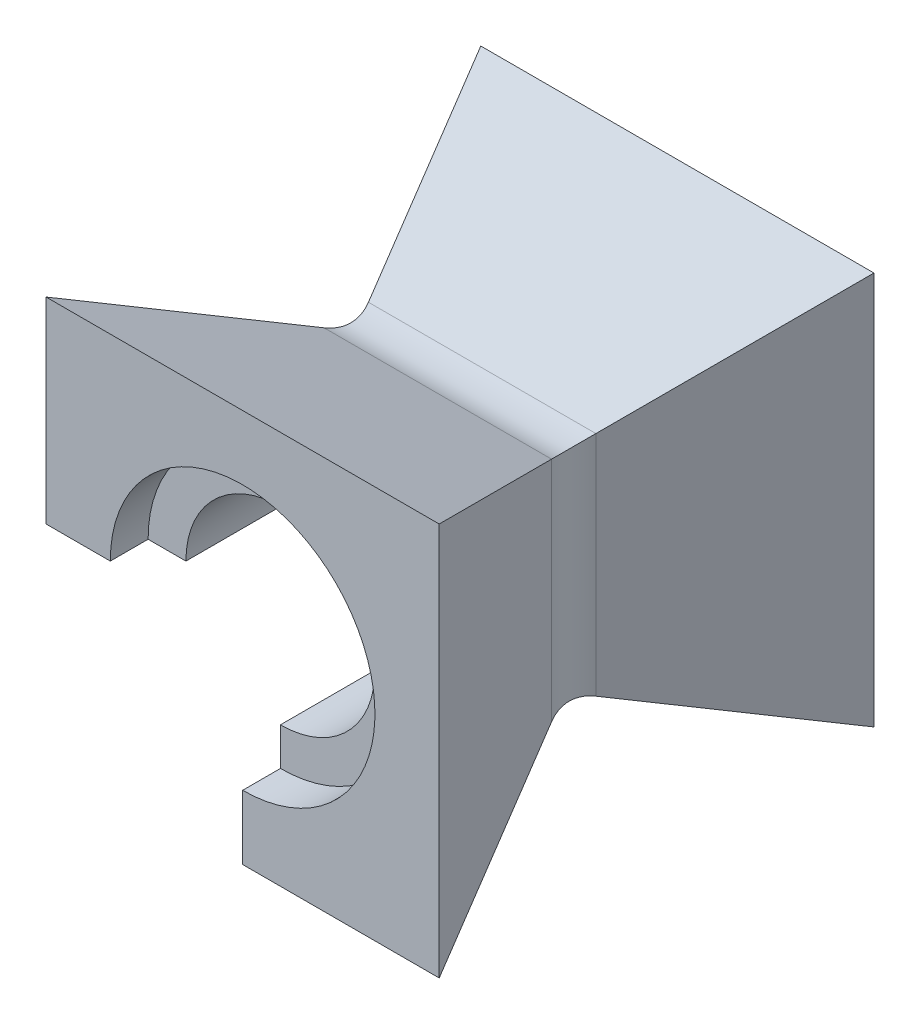
ISO-10303-21;
HEADER;
FILE_DESCRIPTION(('STEP AP214'),'2;1');
FILE_NAME('part.step','',(''),(''),'','','');
FILE_SCHEMA(('AUTOMOTIVE_DESIGN { 1 0 10303 214 1 1 1 1 }'));
ENDSEC;
DATA;
#1=APPLICATION_CONTEXT('core data for automotive mechanical design processes');
#2=APPLICATION_PROTOCOL_DEFINITION('international standard','automotive_design',2000,#1);
#3=PRODUCT_CONTEXT('',#1,'mechanical');
#4=PRODUCT('Part','Part','',(#3));
#5=PRODUCT_RELATED_PRODUCT_CATEGORY('part','',(#4));
#6=PRODUCT_DEFINITION_FORMATION('','',#4);
#7=PRODUCT_DEFINITION_CONTEXT('part definition',#1,'design');
#8=PRODUCT_DEFINITION('design','',#6,#7);
#9=PRODUCT_DEFINITION_SHAPE('','',#8);
#10=(LENGTH_UNIT() NAMED_UNIT(*) SI_UNIT(.MILLI.,.METRE.));
#11=(NAMED_UNIT(*) PLANE_ANGLE_UNIT() SI_UNIT($,.RADIAN.));
#12=(NAMED_UNIT(*) SI_UNIT($,.STERADIAN.) SOLID_ANGLE_UNIT());
#13=UNCERTAINTY_MEASURE_WITH_UNIT(LENGTH_MEASURE(1.E-05),#10,'distance_accuracy_value','');
#14=(GEOMETRIC_REPRESENTATION_CONTEXT(3) GLOBAL_UNCERTAINTY_ASSIGNED_CONTEXT((#13)) GLOBAL_UNIT_ASSIGNED_CONTEXT((#10,
#11,#12)) REPRESENTATION_CONTEXT('',''));
#15=CARTESIAN_POINT('',(0.,0.,0.));
#16=DIRECTION('',(0.,0.,1.));
#17=DIRECTION('',(1.,0.,0.));
#18=AXIS2_PLACEMENT_3D('',#15,#16,#17);
#19=CARTESIAN_POINT('',(52.,52.,-64.5000000000001));
#20=DIRECTION('',(0.,0.,1.));
#21=DIRECTION('',(1.,0.,0.));
#22=AXIS2_PLACEMENT_3D('',#19,#20,#21);
#23=CYLINDRICAL_SURFACE('',#22,25.);
#24=CARTESIAN_POINT('',(52.,52.,105.));
#25=DIRECTION('',(0.,0.,1.));
#26=DIRECTION('',(1.,0.,0.));
#27=AXIS2_PLACEMENT_3D('',#24,#25,#26);
#28=CIRCLE('',#27,25.);
#29=CARTESIAN_POINT('',(27.,52.,105.));
#30=VERTEX_POINT('',#29);
#31=CARTESIAN_POINT('',(51.9999999999997,27.,105.));
#32=VERTEX_POINT('',#31);
#33=EDGE_CURVE('E340',#30,#32,#28,.F.);
#34=ORIENTED_EDGE('',*,*,#33,.F.);
#35=DIRECTION('',(0.,0.,1.));
#36=VECTOR('',#35,1.);
#37=CARTESIAN_POINT('',(27.,52.,-64.5000000000001));
#38=LINE('',#37,#36);
#39=CARTESIAN_POINT('',(27.,52.,10.));
#40=VERTEX_POINT('',#39);
#41=EDGE_CURVE('E210',#30,#40,#38,.F.);
#42=ORIENTED_EDGE('',*,*,#41,.T.);
#43=CARTESIAN_POINT('',(52.,52.,10.));
#44=DIRECTION('',(0.,0.,1.));
#45=DIRECTION('',(1.,0.,0.));
#46=AXIS2_PLACEMENT_3D('',#43,#44,#45);
#47=CIRCLE('',#46,25.);
#48=CARTESIAN_POINT('',(51.9999999999997,27.,10.));
#49=VERTEX_POINT('',#48);
#50=EDGE_CURVE('E234',#49,#40,#47,.T.);
#51=ORIENTED_EDGE('',*,*,#50,.F.);
#52=DIRECTION('',(0.,0.,1.));
#53=VECTOR('',#52,1.);
#54=CARTESIAN_POINT('',(51.9999999999997,27.,-64.5000000000001));
#55=LINE('',#54,#53);
#56=EDGE_CURVE('E328',#49,#32,#55,.T.);
#57=ORIENTED_EDGE('',*,*,#56,.T.);
#58=EDGE_LOOP('',(#34,#42,#51,#57));
#59=FACE_BOUND('',#58,.T.);
#60=ADVANCED_FACE('F65',(#59),#23,.F.);
#61=CARTESIAN_POINT('',(0.,0.,0.));
#62=DIRECTION('',(0.,0.,-1.));
#63=DIRECTION('',(-1.,0.,0.));
#64=AXIS2_PLACEMENT_3D('',#61,#62,#63);
#65=PLANE('',#64);
#66=DIRECTION('',(1.,0.,0.));
#67=VECTOR('',#66,1.);
#68=CARTESIAN_POINT('',(27.,52.,0.));
#69=LINE('',#68,#67);
#70=CARTESIAN_POINT('',(0.,52.,0.));
#71=VERTEX_POINT('',#70);
#72=CARTESIAN_POINT('',(6.99999999999999,52.,0.));
#73=VERTEX_POINT('',#72);
#74=EDGE_CURVE('E333',#71,#73,#69,.T.);
#75=ORIENTED_EDGE('',*,*,#74,.F.);
#76=DIRECTION('',(0.,-1.,0.));
#77=VECTOR('',#76,1.);
#78=CARTESIAN_POINT('',(0.,0.,0.));
#79=LINE('',#78,#77);
#80=CARTESIAN_POINT('',(0.,104.,0.));
#81=VERTEX_POINT('',#80);
#82=EDGE_CURVE('E252',#81,#71,#79,.T.);
#83=ORIENTED_EDGE('',*,*,#82,.F.);
#84=DIRECTION('',(-1.,0.,0.));
#85=VECTOR('',#84,1.);
#86=CARTESIAN_POINT('',(0.,104.,0.));
#87=LINE('',#86,#85);
#88=CARTESIAN_POINT('',(104.,104.,0.));
#89=VERTEX_POINT('',#88);
#90=EDGE_CURVE('E264',#89,#81,#87,.T.);
#91=ORIENTED_EDGE('',*,*,#90,.F.);
#92=DIRECTION('',(0.,1.,0.));
#93=VECTOR('',#92,1.);
#94=CARTESIAN_POINT('',(104.,0.,0.));
#95=LINE('',#94,#93);
#96=CARTESIAN_POINT('',(104.,0.,0.));
#97=VERTEX_POINT('',#96);
#98=EDGE_CURVE('E261',#97,#89,#95,.T.);
#99=ORIENTED_EDGE('',*,*,#98,.F.);
#100=DIRECTION('',(1.,0.,0.));
#101=VECTOR('',#100,1.);
#102=CARTESIAN_POINT('',(0.,0.,0.));
#103=LINE('',#102,#101);
#104=CARTESIAN_POINT('',(52.,0.,0.));
#105=VERTEX_POINT('',#104);
#106=EDGE_CURVE('E258',#105,#97,#103,.T.);
#107=ORIENTED_EDGE('',*,*,#106,.F.);
#108=DIRECTION('',(0.,-1.,0.));
#109=VECTOR('',#108,1.);
#110=CARTESIAN_POINT('',(52.,0.,0.));
#111=LINE('',#110,#109);
#112=CARTESIAN_POINT('',(51.9999999999999,6.99999999999999,0.));
#113=VERTEX_POINT('',#112);
#114=EDGE_CURVE('E335',#113,#105,#111,.T.);
#115=ORIENTED_EDGE('',*,*,#114,.F.);
#116=CARTESIAN_POINT('',(52.,52.,0.));
#117=DIRECTION('',(0.,0.,1.));
#118=DIRECTION('',(1.,0.,0.));
#119=AXIS2_PLACEMENT_3D('',#116,#117,#118);
#120=CIRCLE('',#119,45.);
#121=EDGE_CURVE('E220',#113,#73,#120,.T.);
#122=ORIENTED_EDGE('',*,*,#121,.T.);
#123=EDGE_LOOP('',(#75,#83,#91,#99,#107,#115,#122));
#124=FACE_BOUND('',#123,.T.);
#125=ADVANCED_FACE('F366',(#124),#65,.T.);
#126=CARTESIAN_POINT('',(0.,0.,0.));
#127=DIRECTION('',(-0.92050485345244,0.,0.390731128489275));
#128=DIRECTION('',(0.390731128489275,0.,0.92050485345244));
#129=AXIS2_PLACEMENT_3D('',#126,#127,#128);
#130=PLANE('',#129);
#131=DIRECTION('',(-0.390731128489275,0.,-0.92050485345244));
#132=VECTOR('',#131,1.);
#133=CARTESIAN_POINT('',(0.,52.,0.));
#134=LINE('',#133,#132);
#135=CARTESIAN_POINT('',(21.9194690727595,52.,51.6390330726609));
#136=VERTEX_POINT('',#135);
#137=EDGE_CURVE('E212',#71,#136,#134,.F.);
#138=ORIENTED_EDGE('',*,*,#137,.T.);
#139=DIRECTION('',(0.,-1.,0.));
#140=VECTOR('',#139,1.);
#141=CARTESIAN_POINT('',(21.9194690727595,0.,51.6390330726609));
#142=LINE('',#141,#140);
#143=CARTESIAN_POINT('',(21.9194690727595,82.0805309272405,51.6390330726609));
#144=VERTEX_POINT('',#143);
#145=EDGE_CURVE('E283',#136,#144,#142,.F.);
#146=ORIENTED_EDGE('',*,*,#145,.T.);
#147=DIRECTION('',(-0.363936289648103,0.363936289648103,-0.8573801689766));
#148=VECTOR('',#147,1.);
#149=CARTESIAN_POINT('',(13.7747607839741,90.2252392160259,32.4513027815816));
#150=LINE('',#149,#148);
#151=EDGE_CURVE('E267',#144,#81,#150,.T.);
#152=ORIENTED_EDGE('',*,*,#151,.T.);
#153=ORIENTED_EDGE('',*,*,#82,.T.);
#154=EDGE_LOOP('',(#138,#146,#152,#153));
#155=FACE_BOUND('',#154,.T.);
#156=ADVANCED_FACE('F356',(#155),#130,.T.);
#157=CARTESIAN_POINT('',(0.,0.,0.));
#158=DIRECTION('',(0.,-0.92050485345244,0.390731128489275));
#159=DIRECTION('',(0.,-0.390731128489275,-0.92050485345244));
#160=AXIS2_PLACEMENT_3D('',#157,#158,#159);
#161=PLANE('',#160);
#162=DIRECTION('',(0.363936289648103,-0.363936289648103,-0.8573801689766));
#163=VECTOR('',#162,1.);
#164=CARTESIAN_POINT('',(104.,0.,0.));
#165=LINE('',#164,#163);
#166=CARTESIAN_POINT('',(82.0805309272405,21.9194690727595,51.6390330726609));
#167=VERTEX_POINT('',#166);
#168=EDGE_CURVE('E271',#167,#97,#165,.T.);
#169=ORIENTED_EDGE('',*,*,#168,.F.);
#170=DIRECTION('',(1.,0.,0.));
#171=VECTOR('',#170,1.);
#172=CARTESIAN_POINT('',(0.,21.9194690727595,51.6390330726609));
#173=LINE('',#172,#171);
#174=CARTESIAN_POINT('',(51.9999999999998,21.9194690727595,51.6390330726609));
#175=VERTEX_POINT('',#174);
#176=EDGE_CURVE('E276',#167,#175,#173,.F.);
#177=ORIENTED_EDGE('',*,*,#176,.T.);
#178=DIRECTION('',(0.,0.390731128489275,0.92050485345244));
#179=VECTOR('',#178,1.);
#180=CARTESIAN_POINT('',(52.,0.,1.73035981920801E-13));
#181=LINE('',#180,#179);
#182=EDGE_CURVE('E214',#175,#105,#181,.F.);
#183=ORIENTED_EDGE('',*,*,#182,.T.);
#184=ORIENTED_EDGE('',*,*,#106,.T.);
#185=EDGE_LOOP('',(#169,#177,#183,#184));
#186=FACE_BOUND('',#185,.T.);
#187=ADVANCED_FACE('F310',(#186),#161,.T.);
#188=CARTESIAN_POINT('',(104.,0.,0.));
#189=DIRECTION('',(0.92050485345244,0.,0.390731128489275));
#190=DIRECTION('',(0.390731128489275,0.,-0.92050485345244));
#191=AXIS2_PLACEMENT_3D('',#188,#189,#190);
#192=PLANE('',#191);
#193=DIRECTION('',(0.363936289648103,0.363936289648103,-0.8573801689766));
#194=VECTOR('',#193,1.);
#195=CARTESIAN_POINT('',(90.2252392160259,90.2252392160259,32.4513027815816));
#196=LINE('',#195,#194);
#197=CARTESIAN_POINT('',(82.0805309272405,82.0805309272405,51.6390330726609));
#198=VERTEX_POINT('',#197);
#199=EDGE_CURVE('E269',#198,#89,#196,.T.);
#200=ORIENTED_EDGE('',*,*,#199,.F.);
#201=DIRECTION('',(0.,1.,0.));
#202=VECTOR('',#201,1.);
#203=CARTESIAN_POINT('',(82.0805309272405,0.,51.6390330726609));
#204=LINE('',#203,#202);
#205=EDGE_CURVE('E289',#198,#167,#204,.F.);
#206=ORIENTED_EDGE('',*,*,#205,.T.);
#207=ORIENTED_EDGE('',*,*,#168,.T.);
#208=ORIENTED_EDGE('',*,*,#98,.T.);
#209=EDGE_LOOP('',(#200,#206,#207,#208));
#210=FACE_BOUND('',#209,.T.);
#211=ADVANCED_FACE('F307',(#210),#192,.T.);
#212=CARTESIAN_POINT('',(0.,104.,0.));
#213=DIRECTION('',(0.,0.92050485345244,0.390731128489275));
#214=DIRECTION('',(0.,-0.390731128489275,0.92050485345244));
#215=AXIS2_PLACEMENT_3D('',#212,#213,#214);
#216=PLANE('',#215);
#217=ORIENTED_EDGE('',*,*,#151,.F.);
#218=DIRECTION('',(-1.,0.,0.));
#219=VECTOR('',#218,1.);
#220=CARTESIAN_POINT('',(0.,82.0805309272405,51.6390330726609));
#221=LINE('',#220,#219);
#222=EDGE_CURVE('E82',#144,#198,#221,.F.);
#223=ORIENTED_EDGE('',*,*,#222,.T.);
#224=ORIENTED_EDGE('',*,*,#199,.T.);
#225=ORIENTED_EDGE('',*,*,#90,.T.);
#226=EDGE_LOOP('',(#217,#223,#224,#225));
#227=FACE_BOUND('',#226,.T.);
#228=ADVANCED_FACE('F383',(#227),#216,.T.);
#229=CARTESIAN_POINT('',(0.,0.,115.));
#230=DIRECTION('',(-0.92050485345244,0.,-0.390731128489275));
#231=DIRECTION('',(-0.390731128489275,0.,0.92050485345244));
#232=AXIS2_PLACEMENT_3D('',#229,#230,#231);
#233=PLANE('',#232);
#234=DIRECTION('',(-0.363936289648103,0.363936289648103,0.8573801689766));
#235=VECTOR('',#234,1.);
#236=CARTESIAN_POINT('',(0.,104.,115.));
#237=LINE('',#236,#235);
#238=CARTESIAN_POINT('',(21.9194690727595,82.0805309272405,63.3609669273391));
#239=VERTEX_POINT('',#238);
#240=CARTESIAN_POINT('',(0.,104.,115.));
#241=VERTEX_POINT('',#240);
#242=EDGE_CURVE('E250',#239,#241,#237,.T.);
#243=ORIENTED_EDGE('',*,*,#242,.F.);
#244=DIRECTION('',(0.,1.,0.));
#245=VECTOR('',#244,1.);
#246=CARTESIAN_POINT('',(21.9194690727595,0.,63.3609669273391));
#247=LINE('',#246,#245);
#248=CARTESIAN_POINT('',(21.9194690727595,52.,63.3609669273391));
#249=VERTEX_POINT('',#248);
#250=EDGE_CURVE('E280',#239,#249,#247,.F.);
#251=ORIENTED_EDGE('',*,*,#250,.T.);
#252=DIRECTION('',(0.390731128489275,0.,-0.92050485345244));
#253=VECTOR('',#252,1.);
#254=CARTESIAN_POINT('',(0.,52.,115.));
#255=LINE('',#254,#253);
#256=CARTESIAN_POINT('',(0.,52.,115.));
#257=VERTEX_POINT('',#256);
#258=EDGE_CURVE('E209',#257,#249,#255,.T.);
#259=ORIENTED_EDGE('',*,*,#258,.F.);
#260=DIRECTION('',(0.,-1.,0.));
#261=VECTOR('',#260,1.);
#262=CARTESIAN_POINT('',(0.,0.,115.));
#263=LINE('',#262,#261);
#264=EDGE_CURVE('E208',#241,#257,#263,.T.);
#265=ORIENTED_EDGE('',*,*,#264,.F.);
#266=EDGE_LOOP('',(#243,#251,#259,#265));
#267=FACE_BOUND('',#266,.T.);
#268=ADVANCED_FACE('F353',(#267),#233,.T.);
#269=CARTESIAN_POINT('',(0.,104.,115.));
#270=DIRECTION('',(0.,0.92050485345244,-0.390731128489275));
#271=DIRECTION('',(0.,0.390731128489275,0.92050485345244));
#272=AXIS2_PLACEMENT_3D('',#269,#270,#271);
#273=PLANE('',#272);
#274=DIRECTION('',(0.363936289648103,0.363936289648103,0.8573801689766));
#275=VECTOR('',#274,1.);
#276=CARTESIAN_POINT('',(90.2252392160259,90.2252392160259,82.5486972184184));
#277=LINE('',#276,#275);
#278=CARTESIAN_POINT('',(82.0805309272405,82.0805309272405,63.3609669273391));
#279=VERTEX_POINT('',#278);
#280=CARTESIAN_POINT('',(104.,104.,115.));
#281=VERTEX_POINT('',#280);
#282=EDGE_CURVE('E253',#279,#281,#277,.T.);
#283=ORIENTED_EDGE('',*,*,#282,.F.);
#284=DIRECTION('',(1.,0.,0.));
#285=VECTOR('',#284,1.);
#286=CARTESIAN_POINT('',(0.,82.0805309272405,63.3609669273391));
#287=LINE('',#286,#285);
#288=EDGE_CURVE('E285',#279,#239,#287,.F.);
#289=ORIENTED_EDGE('',*,*,#288,.T.);
#290=ORIENTED_EDGE('',*,*,#242,.T.);
#291=DIRECTION('',(-1.,0.,0.));
#292=VECTOR('',#291,1.);
#293=CARTESIAN_POINT('',(0.,104.,115.));
#294=LINE('',#293,#292);
#295=EDGE_CURVE('E241',#281,#241,#294,.T.);
#296=ORIENTED_EDGE('',*,*,#295,.F.);
#297=EDGE_LOOP('',(#283,#289,#290,#296));
#298=FACE_BOUND('',#297,.T.);
#299=ADVANCED_FACE('F350',(#298),#273,.T.);
#300=CARTESIAN_POINT('',(104.,0.,115.));
#301=DIRECTION('',(0.92050485345244,0.,-0.390731128489275));
#302=DIRECTION('',(-0.390731128489275,0.,-0.92050485345244));
#303=AXIS2_PLACEMENT_3D('',#300,#301,#302);
#304=PLANE('',#303);
#305=DIRECTION('',(0.363936289648103,-0.363936289648103,0.8573801689766));
#306=VECTOR('',#305,1.);
#307=CARTESIAN_POINT('',(90.2252392160259,13.7747607839741,82.5486972184184));
#308=LINE('',#307,#306);
#309=CARTESIAN_POINT('',(82.0805309272405,21.9194690727595,63.3609669273391));
#310=VERTEX_POINT('',#309);
#311=CARTESIAN_POINT('',(104.,0.,115.));
#312=VERTEX_POINT('',#311);
#313=EDGE_CURVE('E249',#310,#312,#308,.T.);
#314=ORIENTED_EDGE('',*,*,#313,.F.);
#315=DIRECTION('',(0.,-1.,0.));
#316=VECTOR('',#315,1.);
#317=CARTESIAN_POINT('',(82.0805309272405,0.,63.3609669273391));
#318=LINE('',#317,#316);
#319=EDGE_CURVE('E90',#310,#279,#318,.F.);
#320=ORIENTED_EDGE('',*,*,#319,.T.);
#321=ORIENTED_EDGE('',*,*,#282,.T.);
#322=DIRECTION('',(0.,1.,0.));
#323=VECTOR('',#322,1.);
#324=CARTESIAN_POINT('',(104.,0.,115.));
#325=LINE('',#324,#323);
#326=EDGE_CURVE('E243',#312,#281,#325,.T.);
#327=ORIENTED_EDGE('',*,*,#326,.F.);
#328=EDGE_LOOP('',(#314,#320,#321,#327));
#329=FACE_BOUND('',#328,.T.);
#330=ADVANCED_FACE('F347',(#329),#304,.T.);
#331=CARTESIAN_POINT('',(0.,0.,115.));
#332=DIRECTION('',(0.,-0.92050485345244,-0.390731128489275));
#333=DIRECTION('',(0.,0.390731128489275,-0.92050485345244));
#334=AXIS2_PLACEMENT_3D('',#331,#332,#333);
#335=PLANE('',#334);
#336=DIRECTION('',(0.,-0.390731128489275,0.92050485345244));
#337=VECTOR('',#336,1.);
#338=CARTESIAN_POINT('',(52.,0.,115.));
#339=LINE('',#338,#337);
#340=CARTESIAN_POINT('',(51.9999999999998,21.9194690727595,63.3609669273391));
#341=VERTEX_POINT('',#340);
#342=CARTESIAN_POINT('',(52.,0.,115.));
#343=VERTEX_POINT('',#342);
#344=EDGE_CURVE('E321',#341,#343,#339,.T.);
#345=ORIENTED_EDGE('',*,*,#344,.F.);
#346=DIRECTION('',(-1.,0.,0.));
#347=VECTOR('',#346,1.);
#348=CARTESIAN_POINT('',(0.,21.9194690727595,63.3609669273391));
#349=LINE('',#348,#347);
#350=EDGE_CURVE('E202',#341,#310,#349,.F.);
#351=ORIENTED_EDGE('',*,*,#350,.T.);
#352=ORIENTED_EDGE('',*,*,#313,.T.);
#353=DIRECTION('',(1.,0.,0.));
#354=VECTOR('',#353,1.);
#355=CARTESIAN_POINT('',(0.,0.,115.));
#356=LINE('',#355,#354);
#357=EDGE_CURVE('E246',#343,#312,#356,.T.);
#358=ORIENTED_EDGE('',*,*,#357,.F.);
#359=EDGE_LOOP('',(#345,#351,#352,#358));
#360=FACE_BOUND('',#359,.T.);
#361=ADVANCED_FACE('F325',(#360),#335,.T.);
#362=CARTESIAN_POINT('',(0.,0.,115.));
#363=DIRECTION('',(0.,0.,1.));
#364=DIRECTION('',(-1.,0.,0.));
#365=AXIS2_PLACEMENT_3D('',#362,#363,#364);
#366=PLANE('',#365);
#367=CARTESIAN_POINT('',(52.,52.,115.));
#368=DIRECTION('',(0.,0.,1.));
#369=DIRECTION('',(1.,0.,0.));
#370=AXIS2_PLACEMENT_3D('',#367,#368,#369);
#371=CIRCLE('',#370,35.);
#372=CARTESIAN_POINT('',(51.9999999999998,17.,115.));
#373=VERTEX_POINT('',#372);
#374=CARTESIAN_POINT('',(17.,52.,115.));
#375=VERTEX_POINT('',#374);
#376=EDGE_CURVE('E181',#373,#375,#371,.T.);
#377=ORIENTED_EDGE('',*,*,#376,.F.);
#378=DIRECTION('',(0.,1.,0.));
#379=VECTOR('',#378,1.);
#380=CARTESIAN_POINT('',(52.,4.81096644004234E-13,115.));
#381=LINE('',#380,#379);
#382=EDGE_CURVE('E326',#343,#373,#381,.T.);
#383=ORIENTED_EDGE('',*,*,#382,.F.);
#384=ORIENTED_EDGE('',*,*,#357,.T.);
#385=ORIENTED_EDGE('',*,*,#326,.T.);
#386=ORIENTED_EDGE('',*,*,#295,.T.);
#387=ORIENTED_EDGE('',*,*,#264,.T.);
#388=DIRECTION('',(-1.,0.,0.));
#389=VECTOR('',#388,1.);
#390=CARTESIAN_POINT('',(0.,52.,115.));
#391=LINE('',#390,#389);
#392=EDGE_CURVE('E198',#375,#257,#391,.T.);
#393=ORIENTED_EDGE('',*,*,#392,.F.);
#394=EDGE_LOOP('',(#377,#383,#384,#385,#386,#387,#393));
#395=FACE_BOUND('',#394,.T.);
#396=ADVANCED_FACE('F205',(#395),#366,.T.);
#397=CARTESIAN_POINT('',(52.,52.,10.));
#398=DIRECTION('',(0.,0.,1.));
#399=DIRECTION('',(1.,0.,0.));
#400=AXIS2_PLACEMENT_3D('',#397,#398,#399);
#401=PLANE('',#400);
#402=DIRECTION('',(0.,1.,0.));
#403=VECTOR('',#402,1.);
#404=CARTESIAN_POINT('',(52.,17.,10.));
#405=LINE('',#404,#403);
#406=CARTESIAN_POINT('',(52.,6.99999999999999,10.));
#407=VERTEX_POINT('',#406);
#408=EDGE_CURVE('E237',#407,#49,#405,.T.);
#409=ORIENTED_EDGE('',*,*,#408,.T.);
#410=ORIENTED_EDGE('',*,*,#50,.T.);
#411=DIRECTION('',(-1.,0.,0.));
#412=VECTOR('',#411,1.);
#413=CARTESIAN_POINT('',(27.,52.,10.));
#414=LINE('',#413,#412);
#415=CARTESIAN_POINT('',(6.99999999999999,52.,10.));
#416=VERTEX_POINT('',#415);
#417=EDGE_CURVE('E231',#40,#416,#414,.T.);
#418=ORIENTED_EDGE('',*,*,#417,.T.);
#419=CARTESIAN_POINT('',(52.,52.,10.));
#420=DIRECTION('',(0.,0.,1.));
#421=DIRECTION('',(1.,0.,0.));
#422=AXIS2_PLACEMENT_3D('',#419,#420,#421);
#423=CIRCLE('',#422,45.);
#424=EDGE_CURVE('E221',#407,#416,#423,.T.);
#425=ORIENTED_EDGE('',*,*,#424,.F.);
#426=EDGE_LOOP('',(#409,#410,#418,#425));
#427=FACE_BOUND('',#426,.T.);
#428=ADVANCED_FACE('F378',(#427),#401,.F.);
#429=CARTESIAN_POINT('',(52.,52.,10.));
#430=DIRECTION('',(0.,0.,-1.));
#431=DIRECTION('',(-1.,0.,0.));
#432=AXIS2_PLACEMENT_3D('',#429,#430,#431);
#433=CYLINDRICAL_SURFACE('',#432,45.);
#434=ORIENTED_EDGE('',*,*,#121,.F.);
#435=DIRECTION('',(0.,0.,-1.));
#436=VECTOR('',#435,1.);
#437=CARTESIAN_POINT('',(52.,6.99999999999999,10.));
#438=LINE('',#437,#436);
#439=EDGE_CURVE('E224',#407,#113,#438,.T.);
#440=ORIENTED_EDGE('',*,*,#439,.F.);
#441=ORIENTED_EDGE('',*,*,#424,.T.);
#442=DIRECTION('',(0.,0.,-1.));
#443=VECTOR('',#442,1.);
#444=CARTESIAN_POINT('',(6.99999999999999,52.,10.));
#445=LINE('',#444,#443);
#446=EDGE_CURVE('E228',#416,#73,#445,.T.);
#447=ORIENTED_EDGE('',*,*,#446,.T.);
#448=EDGE_LOOP('',(#434,#440,#441,#447));
#449=FACE_BOUND('',#448,.T.);
#450=ADVANCED_FACE('F411',(#449),#433,.F.);
#451=CARTESIAN_POINT('',(52.,0.,124.));
#452=DIRECTION('',(1.,0.,0.));
#453=DIRECTION('',(0.,1.,0.));
#454=AXIS2_PLACEMENT_3D('',#451,#452,#453);
#455=PLANE('',#454);
#456=ORIENTED_EDGE('',*,*,#382,.T.);
#457=DIRECTION('',(0.,0.,1.));
#458=VECTOR('',#457,1.);
#459=CARTESIAN_POINT('',(51.9999999999998,17.,105.));
#460=LINE('',#459,#458);
#461=CARTESIAN_POINT('',(51.9999999999998,17.,105.));
#462=VERTEX_POINT('',#461);
#463=EDGE_CURVE('E188',#373,#462,#460,.F.);
#464=ORIENTED_EDGE('',*,*,#463,.T.);
#465=DIRECTION('',(0.,-1.,0.));
#466=VECTOR('',#465,1.);
#467=CARTESIAN_POINT('',(52.,0.,105.));
#468=LINE('',#467,#466);
#469=EDGE_CURVE('E338',#32,#462,#468,.T.);
#470=ORIENTED_EDGE('',*,*,#469,.F.);
#471=ORIENTED_EDGE('',*,*,#56,.F.);
#472=ORIENTED_EDGE('',*,*,#408,.F.);
#473=ORIENTED_EDGE('',*,*,#439,.T.);
#474=ORIENTED_EDGE('',*,*,#114,.T.);
#475=ORIENTED_EDGE('',*,*,#182,.F.);
#476=CARTESIAN_POINT('',(51.9999999999999,8.11189627097289,57.5));
#477=DIRECTION('',(1.,0.,0.));
#478=DIRECTION('',(0.,1.,0.));
#479=AXIS2_PLACEMENT_3D('',#476,#477,#478);
#480=CIRCLE('',#479,15.);
#481=EDGE_CURVE('E278',#175,#341,#480,.T.);
#482=ORIENTED_EDGE('',*,*,#481,.T.);
#483=ORIENTED_EDGE('',*,*,#344,.T.);
#484=EDGE_LOOP('',(#456,#464,#470,#471,#472,#473,#474,#475,#482,#483));
#485=FACE_BOUND('',#484,.T.);
#486=ADVANCED_FACE('F320',(#485),#455,.F.);
#487=CARTESIAN_POINT('',(27.,52.,124.));
#488=DIRECTION('',(0.,1.,0.));
#489=DIRECTION('',(-1.,0.,0.));
#490=AXIS2_PLACEMENT_3D('',#487,#488,#489);
#491=PLANE('',#490);
#492=DIRECTION('',(1.,0.,0.));
#493=VECTOR('',#492,1.);
#494=CARTESIAN_POINT('',(27.,52.,105.));
#495=LINE('',#494,#493);
#496=CARTESIAN_POINT('',(17.,52.,105.));
#497=VERTEX_POINT('',#496);
#498=EDGE_CURVE('E201',#497,#30,#495,.T.);
#499=ORIENTED_EDGE('',*,*,#498,.F.);
#500=DIRECTION('',(0.,0.,1.));
#501=VECTOR('',#500,1.);
#502=CARTESIAN_POINT('',(17.,52.,105.));
#503=LINE('',#502,#501);
#504=EDGE_CURVE('E185',#497,#375,#503,.T.);
#505=ORIENTED_EDGE('',*,*,#504,.T.);
#506=ORIENTED_EDGE('',*,*,#392,.T.);
#507=ORIENTED_EDGE('',*,*,#258,.T.);
#508=CARTESIAN_POINT('',(8.11189627097289,52.,57.5));
#509=DIRECTION('',(0.,1.,0.));
#510=DIRECTION('',(-1.,0.,0.));
#511=AXIS2_PLACEMENT_3D('',#508,#509,#510);
#512=CIRCLE('',#511,15.);
#513=EDGE_CURVE('E74',#249,#136,#512,.T.);
#514=ORIENTED_EDGE('',*,*,#513,.T.);
#515=ORIENTED_EDGE('',*,*,#137,.F.);
#516=ORIENTED_EDGE('',*,*,#74,.T.);
#517=ORIENTED_EDGE('',*,*,#446,.F.);
#518=ORIENTED_EDGE('',*,*,#417,.F.);
#519=ORIENTED_EDGE('',*,*,#41,.F.);
#520=EDGE_LOOP('',(#499,#505,#506,#507,#514,#515,#516,#517,#518,#519));
#521=FACE_BOUND('',#520,.T.);
#522=ADVANCED_FACE('F196',(#521),#491,.F.);
#523=CARTESIAN_POINT('',(52.,52.,105.));
#524=DIRECTION('',(0.,0.,1.));
#525=DIRECTION('',(1.,0.,0.));
#526=AXIS2_PLACEMENT_3D('',#523,#524,#525);
#527=CYLINDRICAL_SURFACE('',#526,35.);
#528=ORIENTED_EDGE('',*,*,#376,.T.);
#529=ORIENTED_EDGE('',*,*,#504,.F.);
#530=CARTESIAN_POINT('',(52.,52.,105.));
#531=DIRECTION('',(0.,0.,1.));
#532=DIRECTION('',(1.,0.,0.));
#533=AXIS2_PLACEMENT_3D('',#530,#531,#532);
#534=CIRCLE('',#533,35.);
#535=EDGE_CURVE('E193',#462,#497,#534,.T.);
#536=ORIENTED_EDGE('',*,*,#535,.F.);
#537=ORIENTED_EDGE('',*,*,#463,.F.);
#538=EDGE_LOOP('',(#528,#529,#536,#537));
#539=FACE_BOUND('',#538,.T.);
#540=ADVANCED_FACE('F183',(#539),#527,.F.);
#541=CARTESIAN_POINT('',(52.,52.,105.));
#542=DIRECTION('',(0.,0.,1.));
#543=DIRECTION('',(1.,0.,0.));
#544=AXIS2_PLACEMENT_3D('',#541,#542,#543);
#545=PLANE('',#544);
#546=ORIENTED_EDGE('',*,*,#469,.T.);
#547=ORIENTED_EDGE('',*,*,#535,.T.);
#548=ORIENTED_EDGE('',*,*,#498,.T.);
#549=ORIENTED_EDGE('',*,*,#33,.T.);
#550=EDGE_LOOP('',(#546,#547,#548,#549));
#551=FACE_BOUND('',#550,.T.);
#552=ADVANCED_FACE('F343',(#551),#545,.T.);
#553=CARTESIAN_POINT('',(0.,8.11189627097289,57.5));
#554=DIRECTION('',(-1.,0.,0.));
#555=DIRECTION('',(0.,0.,1.));
#556=AXIS2_PLACEMENT_3D('',#553,#554,#555);
#557=CYLINDRICAL_SURFACE('',#556,15.);
#558=ORIENTED_EDGE('',*,*,#481,.F.);
#559=ORIENTED_EDGE('',*,*,#176,.F.);
#560=CARTESIAN_POINT('',(95.8881037290271,8.11189627097289,57.5));
#561=DIRECTION('',(-0.707106781186547,-0.707106781186547,0.));
#562=DIRECTION('',(-0.707106781186547,0.707106781186547,0.));
#563=AXIS2_PLACEMENT_3D('',#560,#561,#562);
#564=ELLIPSE('',#563,21.2132034355964,15.);
#565=EDGE_CURVE('E12',#167,#310,#564,.F.);
#566=ORIENTED_EDGE('',*,*,#565,.T.);
#567=ORIENTED_EDGE('',*,*,#350,.F.);
#568=EDGE_LOOP('',(#558,#559,#566,#567));
#569=FACE_BOUND('',#568,.T.);
#570=ADVANCED_FACE('F316',(#569),#557,.F.);
#571=CARTESIAN_POINT('',(95.8881037290271,0.,57.5));
#572=DIRECTION('',(0.,-1.,0.));
#573=DIRECTION('',(0.,0.,-1.));
#574=AXIS2_PLACEMENT_3D('',#571,#572,#573);
#575=CYLINDRICAL_SURFACE('',#574,15.);
#576=ORIENTED_EDGE('',*,*,#565,.F.);
#577=ORIENTED_EDGE('',*,*,#205,.F.);
#578=CARTESIAN_POINT('',(95.8881037290271,95.8881037290271,57.5));
#579=DIRECTION('',(0.707106781186547,-0.707106781186547,0.));
#580=DIRECTION('',(-0.707106781186547,-0.707106781186547,0.));
#581=AXIS2_PLACEMENT_3D('',#578,#579,#580);
#582=ELLIPSE('',#581,21.2132034355964,15.);
#583=EDGE_CURVE('E69',#279,#198,#582,.T.);
#584=ORIENTED_EDGE('',*,*,#583,.F.);
#585=ORIENTED_EDGE('',*,*,#319,.F.);
#586=EDGE_LOOP('',(#576,#577,#584,#585));
#587=FACE_BOUND('',#586,.T.);
#588=ADVANCED_FACE('F67',(#587),#575,.F.);
#589=CARTESIAN_POINT('',(0.,95.8881037290271,57.5));
#590=DIRECTION('',(1.,0.,0.));
#591=DIRECTION('',(0.,0.,-1.));
#592=AXIS2_PLACEMENT_3D('',#589,#590,#591);
#593=CYLINDRICAL_SURFACE('',#592,15.);
#594=ORIENTED_EDGE('',*,*,#583,.T.);
#595=ORIENTED_EDGE('',*,*,#222,.F.);
#596=CARTESIAN_POINT('',(8.11189627097289,95.8881037290271,57.5));
#597=DIRECTION('',(0.707106781186547,0.707106781186547,0.));
#598=DIRECTION('',(0.707106781186547,-0.707106781186547,0.));
#599=AXIS2_PLACEMENT_3D('',#596,#597,#598);
#600=ELLIPSE('',#599,21.2132034355964,15.);
#601=EDGE_CURVE('E291',#239,#144,#600,.T.);
#602=ORIENTED_EDGE('',*,*,#601,.F.);
#603=ORIENTED_EDGE('',*,*,#288,.F.);
#604=EDGE_LOOP('',(#594,#595,#602,#603));
#605=FACE_BOUND('',#604,.T.);
#606=ADVANCED_FACE('F301',(#605),#593,.F.);
#607=CARTESIAN_POINT('',(8.11189627097289,0.,57.5));
#608=DIRECTION('',(0.,1.,0.));
#609=DIRECTION('',(0.,0.,1.));
#610=AXIS2_PLACEMENT_3D('',#607,#608,#609);
#611=CYLINDRICAL_SURFACE('',#610,15.);
#612=ORIENTED_EDGE('',*,*,#601,.T.);
#613=ORIENTED_EDGE('',*,*,#145,.F.);
#614=ORIENTED_EDGE('',*,*,#513,.F.);
#615=ORIENTED_EDGE('',*,*,#250,.F.);
#616=EDGE_LOOP('',(#612,#613,#614,#615));
#617=FACE_BOUND('',#616,.T.);
#618=ADVANCED_FACE('F358',(#617),#611,.F.);
#619=CLOSED_SHELL('',(#60,#125,#156,#187,#211,#228,#268,#299,#330,#361,#396,#428,#450,#486,#522,
#540,#552,#570,#588,#606,#618));
#620=MANIFOLD_SOLID_BREP('B2',#619);
#621=ADVANCED_BREP_SHAPE_REPRESENTATION('',(#18,#620),#14);
#622=SHAPE_DEFINITION_REPRESENTATION(#9,#621);
ENDSEC;
END-ISO-10303-21;
